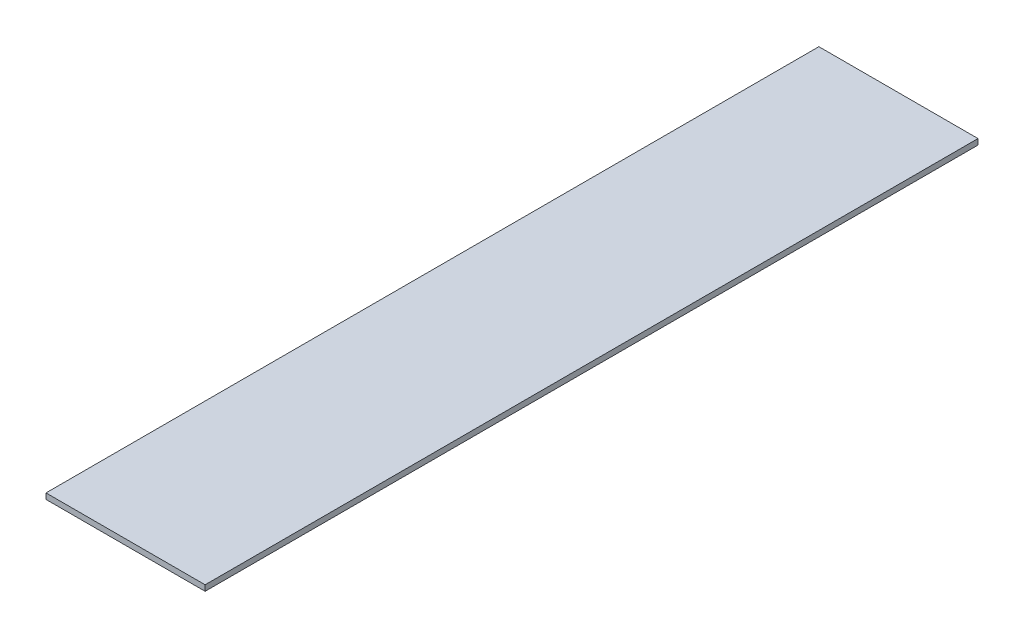
ISO-10303-21;
HEADER;
FILE_DESCRIPTION(('STEP AP214'),'2;1');
FILE_NAME('part.step','',(''),(''),'','','');
FILE_SCHEMA(('AUTOMOTIVE_DESIGN { 1 0 10303 214 1 1 1 1 }'));
ENDSEC;
DATA;
#1=APPLICATION_CONTEXT('core data for automotive mechanical design processes');
#2=APPLICATION_PROTOCOL_DEFINITION('international standard','automotive_design',2000,#1);
#3=PRODUCT_CONTEXT('',#1,'mechanical');
#4=PRODUCT('Part','Part','',(#3));
#5=PRODUCT_RELATED_PRODUCT_CATEGORY('part','',(#4));
#6=PRODUCT_DEFINITION_FORMATION('','',#4);
#7=PRODUCT_DEFINITION_CONTEXT('part definition',#1,'design');
#8=PRODUCT_DEFINITION('design','',#6,#7);
#9=PRODUCT_DEFINITION_SHAPE('','',#8);
#10=(LENGTH_UNIT() NAMED_UNIT(*) SI_UNIT(.MILLI.,.METRE.));
#11=(NAMED_UNIT(*) PLANE_ANGLE_UNIT() SI_UNIT($,.RADIAN.));
#12=(NAMED_UNIT(*) SI_UNIT($,.STERADIAN.) SOLID_ANGLE_UNIT());
#13=UNCERTAINTY_MEASURE_WITH_UNIT(LENGTH_MEASURE(1.E-05),#10,'distance_accuracy_value','');
#14=(GEOMETRIC_REPRESENTATION_CONTEXT(3) GLOBAL_UNCERTAINTY_ASSIGNED_CONTEXT((#13)) GLOBAL_UNIT_ASSIGNED_CONTEXT((#10,
#11,#12)) REPRESENTATION_CONTEXT('',''));
#15=CARTESIAN_POINT('',(0.,0.,0.));
#16=DIRECTION('',(0.,0.,1.));
#17=DIRECTION('',(1.,0.,0.));
#18=AXIS2_PLACEMENT_3D('',#15,#16,#17);
#19=CARTESIAN_POINT('',(-70.,255.,-700.));
#20=DIRECTION('',(-1.,0.,0.));
#21=DIRECTION('',(0.,0.,1.));
#22=AXIS2_PLACEMENT_3D('',#19,#20,#21);
#23=PLANE('',#22);
#24=DIRECTION('',(0.,-1.,0.));
#25=VECTOR('',#24,1.);
#26=CARTESIAN_POINT('',(-70.,255.,-20.));
#27=LINE('',#26,#25);
#28=CARTESIAN_POINT('',(-70.,260.,-20.));
#29=VERTEX_POINT('',#28);
#30=CARTESIAN_POINT('',(-70.,255.,-20.));
#31=VERTEX_POINT('',#30);
#32=EDGE_CURVE('E103',#29,#31,#27,.T.);
#33=ORIENTED_EDGE('',*,*,#32,.F.);
#34=DIRECTION('',(0.,0.,1.));
#35=VECTOR('',#34,1.);
#36=CARTESIAN_POINT('',(-70.,260.,-700.));
#37=LINE('',#36,#35);
#38=CARTESIAN_POINT('',(-70.,260.,-700.));
#39=VERTEX_POINT('',#38);
#40=EDGE_CURVE('E11',#39,#29,#37,.T.);
#41=ORIENTED_EDGE('',*,*,#40,.F.);
#42=DIRECTION('',(0.,-1.,0.));
#43=VECTOR('',#42,1.);
#44=CARTESIAN_POINT('',(-70.,255.,-700.));
#45=LINE('',#44,#43);
#46=CARTESIAN_POINT('',(-70.,255.,-700.));
#47=VERTEX_POINT('',#46);
#48=EDGE_CURVE('E97',#39,#47,#45,.T.);
#49=ORIENTED_EDGE('',*,*,#48,.T.);
#50=DIRECTION('',(0.,0.,1.));
#51=VECTOR('',#50,1.);
#52=CARTESIAN_POINT('',(-70.,255.,-700.));
#53=LINE('',#52,#51);
#54=EDGE_CURVE('E42',#47,#31,#53,.T.);
#55=ORIENTED_EDGE('',*,*,#54,.T.);
#56=EDGE_LOOP('',(#33,#41,#49,#55));
#57=FACE_BOUND('',#56,.T.);
#58=ADVANCED_FACE('F39',(#57),#23,.T.);
#59=CARTESIAN_POINT('',(-70.,260.,-700.));
#60=DIRECTION('',(0.,1.,0.));
#61=DIRECTION('',(0.,0.,1.));
#62=AXIS2_PLACEMENT_3D('',#59,#60,#61);
#63=PLANE('',#62);
#64=DIRECTION('',(-1.,0.,0.));
#65=VECTOR('',#64,1.);
#66=CARTESIAN_POINT('',(-70.,260.,-20.));
#67=LINE('',#66,#65);
#68=CARTESIAN_POINT('',(70.,260.,-20.));
#69=VERTEX_POINT('',#68);
#70=EDGE_CURVE('E99',#69,#29,#67,.T.);
#71=ORIENTED_EDGE('',*,*,#70,.F.);
#72=DIRECTION('',(0.,0.,1.));
#73=VECTOR('',#72,1.);
#74=CARTESIAN_POINT('',(70.,260.,-700.));
#75=LINE('',#74,#73);
#76=CARTESIAN_POINT('',(70.,260.,-700.));
#77=VERTEX_POINT('',#76);
#78=EDGE_CURVE('E48',#77,#69,#75,.T.);
#79=ORIENTED_EDGE('',*,*,#78,.F.);
#80=DIRECTION('',(-1.,0.,0.));
#81=VECTOR('',#80,1.);
#82=CARTESIAN_POINT('',(-70.,260.,-700.));
#83=LINE('',#82,#81);
#84=EDGE_CURVE('E94',#77,#39,#83,.T.);
#85=ORIENTED_EDGE('',*,*,#84,.T.);
#86=ORIENTED_EDGE('',*,*,#40,.T.);
#87=EDGE_LOOP('',(#71,#79,#85,#86));
#88=FACE_BOUND('',#87,.T.);
#89=ADVANCED_FACE('F113',(#88),#63,.T.);
#90=CARTESIAN_POINT('',(70.,255.,-700.));
#91=DIRECTION('',(1.,0.,0.));
#92=DIRECTION('',(0.,0.,-1.));
#93=AXIS2_PLACEMENT_3D('',#90,#91,#92);
#94=PLANE('',#93);
#95=DIRECTION('',(0.,1.,0.));
#96=VECTOR('',#95,1.);
#97=CARTESIAN_POINT('',(70.,255.,-20.));
#98=LINE('',#97,#96);
#99=CARTESIAN_POINT('',(70.,255.,-20.));
#100=VERTEX_POINT('',#99);
#101=EDGE_CURVE('E89',#100,#69,#98,.T.);
#102=ORIENTED_EDGE('',*,*,#101,.F.);
#103=DIRECTION('',(0.,0.,1.));
#104=VECTOR('',#103,1.);
#105=CARTESIAN_POINT('',(70.,255.,-700.));
#106=LINE('',#105,#104);
#107=CARTESIAN_POINT('',(70.,255.,-700.));
#108=VERTEX_POINT('',#107);
#109=EDGE_CURVE('E84',#108,#100,#106,.T.);
#110=ORIENTED_EDGE('',*,*,#109,.F.);
#111=DIRECTION('',(0.,1.,0.));
#112=VECTOR('',#111,1.);
#113=CARTESIAN_POINT('',(70.,255.,-700.));
#114=LINE('',#113,#112);
#115=EDGE_CURVE('E87',#108,#77,#114,.T.);
#116=ORIENTED_EDGE('',*,*,#115,.T.);
#117=ORIENTED_EDGE('',*,*,#78,.T.);
#118=EDGE_LOOP('',(#102,#110,#116,#117));
#119=FACE_BOUND('',#118,.T.);
#120=ADVANCED_FACE('F86',(#119),#94,.T.);
#121=CARTESIAN_POINT('',(-70.,255.,-700.));
#122=DIRECTION('',(0.,-1.,0.));
#123=DIRECTION('',(0.,0.,-1.));
#124=AXIS2_PLACEMENT_3D('',#121,#122,#123);
#125=PLANE('',#124);
#126=DIRECTION('',(1.,0.,0.));
#127=VECTOR('',#126,1.);
#128=CARTESIAN_POINT('',(-70.,255.,-20.));
#129=LINE('',#128,#127);
#130=EDGE_CURVE('E106',#31,#100,#129,.T.);
#131=ORIENTED_EDGE('',*,*,#130,.F.);
#132=ORIENTED_EDGE('',*,*,#54,.F.);
#133=DIRECTION('',(1.,0.,0.));
#134=VECTOR('',#133,1.);
#135=CARTESIAN_POINT('',(-70.,255.,-700.));
#136=LINE('',#135,#134);
#137=EDGE_CURVE('E93',#47,#108,#136,.T.);
#138=ORIENTED_EDGE('',*,*,#137,.T.);
#139=ORIENTED_EDGE('',*,*,#109,.T.);
#140=EDGE_LOOP('',(#131,#132,#138,#139));
#141=FACE_BOUND('',#140,.T.);
#142=ADVANCED_FACE('F96',(#141),#125,.T.);
#143=CARTESIAN_POINT('',(0.,0.,-700.));
#144=DIRECTION('',(0.,0.,-1.));
#145=DIRECTION('',(-1.,0.,0.));
#146=AXIS2_PLACEMENT_3D('',#143,#144,#145);
#147=PLANE('',#146);
#148=ORIENTED_EDGE('',*,*,#48,.F.);
#149=ORIENTED_EDGE('',*,*,#84,.F.);
#150=ORIENTED_EDGE('',*,*,#115,.F.);
#151=ORIENTED_EDGE('',*,*,#137,.F.);
#152=EDGE_LOOP('',(#148,#149,#150,#151));
#153=FACE_BOUND('',#152,.T.);
#154=ADVANCED_FACE('F92',(#153),#147,.T.);
#155=CARTESIAN_POINT('',(0.,0.,-20.));
#156=DIRECTION('',(0.,0.,-1.));
#157=DIRECTION('',(-1.,0.,0.));
#158=AXIS2_PLACEMENT_3D('',#155,#156,#157);
#159=PLANE('',#158);
#160=ORIENTED_EDGE('',*,*,#32,.T.);
#161=ORIENTED_EDGE('',*,*,#130,.T.);
#162=ORIENTED_EDGE('',*,*,#101,.T.);
#163=ORIENTED_EDGE('',*,*,#70,.T.);
#164=EDGE_LOOP('',(#160,#161,#162,#163));
#165=FACE_BOUND('',#164,.T.);
#166=ADVANCED_FACE('F112',(#165),#159,.F.);
#167=CLOSED_SHELL('',(#58,#89,#120,#142,#154,#166));
#168=MANIFOLD_SOLID_BREP('B2',#167);
#169=ADVANCED_BREP_SHAPE_REPRESENTATION('',(#18,#168),#14);
#170=SHAPE_DEFINITION_REPRESENTATION(#9,#169);
ENDSEC;
END-ISO-10303-21;
